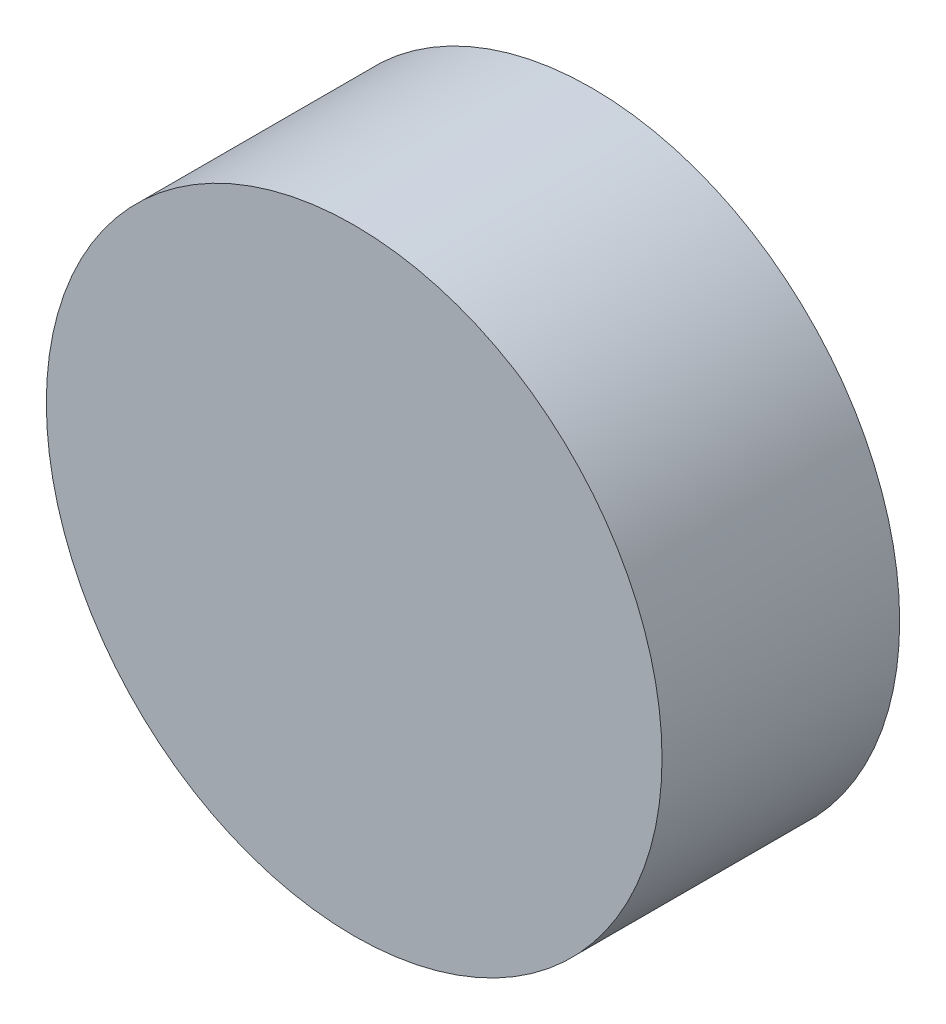
ISO-10303-21;
HEADER;
FILE_DESCRIPTION(('STEP AP214'),'2;1');
FILE_NAME('part.step','',(''),(''),'','','');
FILE_SCHEMA(('AUTOMOTIVE_DESIGN { 1 0 10303 214 1 1 1 1 }'));
ENDSEC;
DATA;
#1=APPLICATION_CONTEXT('core data for automotive mechanical design processes');
#2=APPLICATION_PROTOCOL_DEFINITION('international standard','automotive_design',2000,#1);
#3=PRODUCT_CONTEXT('',#1,'mechanical');
#4=PRODUCT('Part','Part','',(#3));
#5=PRODUCT_RELATED_PRODUCT_CATEGORY('part','',(#4));
#6=PRODUCT_DEFINITION_FORMATION('','',#4);
#7=PRODUCT_DEFINITION_CONTEXT('part definition',#1,'design');
#8=PRODUCT_DEFINITION('design','',#6,#7);
#9=PRODUCT_DEFINITION_SHAPE('','',#8);
#10=(LENGTH_UNIT() NAMED_UNIT(*) SI_UNIT(.MILLI.,.METRE.));
#11=(NAMED_UNIT(*) PLANE_ANGLE_UNIT() SI_UNIT($,.RADIAN.));
#12=(NAMED_UNIT(*) SI_UNIT($,.STERADIAN.) SOLID_ANGLE_UNIT());
#13=UNCERTAINTY_MEASURE_WITH_UNIT(LENGTH_MEASURE(1.E-05),#10,'distance_accuracy_value','');
#14=(GEOMETRIC_REPRESENTATION_CONTEXT(3) GLOBAL_UNCERTAINTY_ASSIGNED_CONTEXT((#13)) GLOBAL_UNIT_ASSIGNED_CONTEXT((#10,
#11,#12)) REPRESENTATION_CONTEXT('',''));
#15=CARTESIAN_POINT('',(0.,0.,0.));
#16=DIRECTION('',(0.,0.,1.));
#17=DIRECTION('',(1.,0.,0.));
#18=AXIS2_PLACEMENT_3D('',#15,#16,#17);
#19=CARTESIAN_POINT('',(-28.51,-1.0770329614269,-97.));
#20=DIRECTION('',(0.,0.,-1.));
#21=DIRECTION('',(0.,1.,0.));
#22=AXIS2_PLACEMENT_3D('',#19,#20,#21);
#23=PLANE('',#22);
#24=CARTESIAN_POINT('',(-16.6207701385947,12.,-97.));
#25=DIRECTION('',(0.,0.,-1.));
#26=DIRECTION('',(-1.,0.,0.));
#27=AXIS2_PLACEMENT_3D('',#24,#25,#26);
#28=CIRCLE('',#27,3.5);
#29=CARTESIAN_POINT('',(-19.4584626012816,14.0487804878049,-97.));
#30=VERTEX_POINT('',#29);
#31=CARTESIAN_POINT('',(-13.7830776759078,9.95121951219513,-97.));
#32=VERTEX_POINT('',#31);
#33=EDGE_CURVE('E121',#30,#32,#28,.T.);
#34=ORIENTED_EDGE('',*,*,#33,.F.);
#35=CARTESIAN_POINT('',(0.,0.,-97.));
#36=DIRECTION('',(0.,0.,-1.));
#37=DIRECTION('',(-1.,0.,0.));
#38=AXIS2_PLACEMENT_3D('',#35,#36,#37);
#39=CIRCLE('',#38,24.);
#40=CARTESIAN_POINT('',(-23.9952229713803,-0.478826224994294,-97.));
#41=VERTEX_POINT('',#40);
#42=EDGE_CURVE('E126',#41,#30,#39,.T.);
#43=ORIENTED_EDGE('',*,*,#42,.F.);
#44=CARTESIAN_POINT('',(-20.4959196213874,-0.408997400515948,-97.));
#45=DIRECTION('',(0.,0.,-1.));
#46=DIRECTION('',(-1.,0.,0.));
#47=AXIS2_PLACEMENT_3D('',#44,#45,#46);
#48=CIRCLE('',#47,3.5);
#49=CARTESIAN_POINT('',(-16.9966162713944,-0.339168576037625,-97.));
#50=VERTEX_POINT('',#49);
#51=EDGE_CURVE('E108',#50,#41,#48,.T.);
#52=ORIENTED_EDGE('',*,*,#51,.F.);
#53=CARTESIAN_POINT('',(0.,0.,-97.));
#54=DIRECTION('',(0.,0.,1.));
#55=DIRECTION('',(-1.,0.,0.));
#56=AXIS2_PLACEMENT_3D('',#53,#54,#55);
#57=CIRCLE('',#56,17.);
#58=EDGE_CURVE('E120',#32,#50,#57,.T.);
#59=ORIENTED_EDGE('',*,*,#58,.F.);
#60=EDGE_LOOP('',(#34,#43,#52,#59));
#61=FACE_BOUND('',#60,.T.);
#62=CARTESIAN_POINT('',(16.6207701385947,12.,-97.));
#63=DIRECTION('',(0.,0.,-1.));
#64=DIRECTION('',(1.,0.,0.));
#65=AXIS2_PLACEMENT_3D('',#62,#63,#64);
#66=CIRCLE('',#65,3.5);
#67=CARTESIAN_POINT('',(13.7830776759078,9.95121951219513,-97.));
#68=VERTEX_POINT('',#67);
#69=CARTESIAN_POINT('',(19.4584626012816,14.0487804878049,-97.));
#70=VERTEX_POINT('',#69);
#71=EDGE_CURVE('E166',#68,#70,#66,.T.);
#72=ORIENTED_EDGE('',*,*,#71,.F.);
#73=CARTESIAN_POINT('',(0.,0.,-97.));
#74=DIRECTION('',(0.,0.,1.));
#75=DIRECTION('',(1.,0.,0.));
#76=AXIS2_PLACEMENT_3D('',#73,#74,#75);
#77=CIRCLE('',#76,17.);
#78=CARTESIAN_POINT('',(16.9966162713944,-0.339168576037625,-97.));
#79=VERTEX_POINT('',#78);
#80=EDGE_CURVE('E164',#79,#68,#77,.T.);
#81=ORIENTED_EDGE('',*,*,#80,.F.);
#82=CARTESIAN_POINT('',(20.4959196213874,-0.408997400515948,-97.));
#83=DIRECTION('',(0.,0.,-1.));
#84=DIRECTION('',(1.,0.,0.));
#85=AXIS2_PLACEMENT_3D('',#82,#83,#84);
#86=CIRCLE('',#85,3.5);
#87=CARTESIAN_POINT('',(23.9952229713803,-0.478826224994294,-97.));
#88=VERTEX_POINT('',#87);
#89=EDGE_CURVE('E134',#88,#79,#86,.T.);
#90=ORIENTED_EDGE('',*,*,#89,.F.);
#91=CARTESIAN_POINT('',(0.,0.,-97.));
#92=DIRECTION('',(0.,0.,-1.));
#93=DIRECTION('',(1.,0.,0.));
#94=AXIS2_PLACEMENT_3D('',#91,#92,#93);
#95=CIRCLE('',#94,24.);
#96=EDGE_CURVE('E152',#70,#88,#95,.T.);
#97=ORIENTED_EDGE('',*,*,#96,.F.);
#98=EDGE_LOOP('',(#72,#81,#90,#97));
#99=FACE_BOUND('',#98,.T.);
#100=CARTESIAN_POINT('',(0.,0.,-97.));
#101=DIRECTION('',(0.,0.,1.));
#102=DIRECTION('',(1.,0.,0.));
#103=AXIS2_PLACEMENT_3D('',#100,#101,#102);
#104=CIRCLE('',#103,28.5);
#105=CARTESIAN_POINT('',(28.5,0.,-97.));
#106=VERTEX_POINT('',#105);
#107=EDGE_CURVE('E139',#106,#106,#104,.T.);
#108=ORIENTED_EDGE('',*,*,#107,.F.);
#109=EDGE_LOOP('',(#108));
#110=FACE_BOUND('',#109,.T.);
#111=ADVANCED_FACE('F41',(#61,#99,#110),#23,.T.);
#112=CARTESIAN_POINT('',(-28.51,27.5,-75.));
#113=DIRECTION('',(0.,0.,1.));
#114=DIRECTION('',(1.,0.,0.));
#115=AXIS2_PLACEMENT_3D('',#112,#113,#114);
#116=PLANE('',#115);
#117=CARTESIAN_POINT('',(0.,0.,-75.));
#118=DIRECTION('',(0.,0.,1.));
#119=DIRECTION('',(1.,0.,0.));
#120=AXIS2_PLACEMENT_3D('',#117,#118,#119);
#121=CIRCLE('',#120,28.5);
#122=CARTESIAN_POINT('',(28.5,0.,-75.));
#123=VERTEX_POINT('',#122);
#124=EDGE_CURVE('E141',#123,#123,#121,.T.);
#125=ORIENTED_EDGE('',*,*,#124,.T.);
#126=EDGE_LOOP('',(#125));
#127=FACE_BOUND('',#126,.T.);
#128=ADVANCED_FACE('F43',(#127),#116,.T.);
#129=CARTESIAN_POINT('',(20.4959196213874,-0.408997400515948,-92.));
#130=DIRECTION('',(0.,0.,-1.));
#131=DIRECTION('',(-1.,0.,0.));
#132=AXIS2_PLACEMENT_3D('',#129,#130,#131);
#133=CYLINDRICAL_SURFACE('',#132,3.5);
#134=ORIENTED_EDGE('',*,*,#89,.T.);
#135=DIRECTION('',(0.,0.,-1.));
#136=VECTOR('',#135,1.);
#137=CARTESIAN_POINT('',(16.9966162713944,-0.339168576037625,-92.));
#138=LINE('',#137,#136);
#139=CARTESIAN_POINT('',(16.9966162713944,-0.339168576037625,-92.));
#140=VERTEX_POINT('',#139);
#141=EDGE_CURVE('E161',#140,#79,#138,.T.);
#142=ORIENTED_EDGE('',*,*,#141,.F.);
#143=CARTESIAN_POINT('',(20.4959196213874,-0.408997400515948,-92.));
#144=DIRECTION('',(0.,0.,-1.));
#145=DIRECTION('',(1.,0.,0.));
#146=AXIS2_PLACEMENT_3D('',#143,#144,#145);
#147=CIRCLE('',#146,3.5);
#148=CARTESIAN_POINT('',(23.9952229713803,-0.478826224994294,-92.));
#149=VERTEX_POINT('',#148);
#150=EDGE_CURVE('E148',#149,#140,#147,.T.);
#151=ORIENTED_EDGE('',*,*,#150,.F.);
#152=DIRECTION('',(0.,0.,-1.));
#153=VECTOR('',#152,1.);
#154=CARTESIAN_POINT('',(23.9952229713803,-0.478826224994294,-92.));
#155=LINE('',#154,#153);
#156=EDGE_CURVE('E11',#149,#88,#155,.T.);
#157=ORIENTED_EDGE('',*,*,#156,.T.);
#158=EDGE_LOOP('',(#134,#142,#151,#157));
#159=FACE_BOUND('',#158,.T.);
#160=ADVANCED_FACE('F196',(#159),#133,.F.);
#161=CARTESIAN_POINT('',(10.2479598106937,-0.204498700257974,-92.));
#162=DIRECTION('',(0.,0.,1.));
#163=DIRECTION('',(1.,0.,0.));
#164=AXIS2_PLACEMENT_3D('',#161,#162,#163);
#165=PLANE('',#164);
#166=ORIENTED_EDGE('',*,*,#150,.T.);
#167=CARTESIAN_POINT('',(0.,0.,-92.));
#168=DIRECTION('',(0.,0.,1.));
#169=DIRECTION('',(1.,0.,0.));
#170=AXIS2_PLACEMENT_3D('',#167,#168,#169);
#171=CIRCLE('',#170,17.);
#172=CARTESIAN_POINT('',(13.7830776759078,9.95121951219513,-92.));
#173=VERTEX_POINT('',#172);
#174=EDGE_CURVE('E151',#140,#173,#171,.T.);
#175=ORIENTED_EDGE('',*,*,#174,.T.);
#176=CARTESIAN_POINT('',(16.6207701385947,12.,-92.));
#177=DIRECTION('',(0.,0.,-1.));
#178=DIRECTION('',(1.,0.,0.));
#179=AXIS2_PLACEMENT_3D('',#176,#177,#178);
#180=CIRCLE('',#179,3.5);
#181=CARTESIAN_POINT('',(19.4584626012816,14.0487804878049,-92.));
#182=VERTEX_POINT('',#181);
#183=EDGE_CURVE('E155',#173,#182,#180,.T.);
#184=ORIENTED_EDGE('',*,*,#183,.T.);
#185=CARTESIAN_POINT('',(0.,0.,-92.));
#186=DIRECTION('',(0.,0.,-1.));
#187=DIRECTION('',(1.,0.,0.));
#188=AXIS2_PLACEMENT_3D('',#185,#186,#187);
#189=CIRCLE('',#188,24.);
#190=EDGE_CURVE('E158',#182,#149,#189,.T.);
#191=ORIENTED_EDGE('',*,*,#190,.T.);
#192=EDGE_LOOP('',(#166,#175,#184,#191));
#193=FACE_BOUND('',#192,.T.);
#194=ADVANCED_FACE('F194',(#193),#165,.F.);
#195=CARTESIAN_POINT('',(16.6207701385947,12.,-92.));
#196=DIRECTION('',(0.,0.,-1.));
#197=DIRECTION('',(-1.,0.,0.));
#198=AXIS2_PLACEMENT_3D('',#195,#196,#197);
#199=CYLINDRICAL_SURFACE('',#198,3.5);
#200=ORIENTED_EDGE('',*,*,#71,.T.);
#201=DIRECTION('',(0.,0.,-1.));
#202=VECTOR('',#201,1.);
#203=CARTESIAN_POINT('',(19.4584626012816,14.0487804878049,-92.));
#204=LINE('',#203,#202);
#205=EDGE_CURVE('E51',#182,#70,#204,.T.);
#206=ORIENTED_EDGE('',*,*,#205,.F.);
#207=ORIENTED_EDGE('',*,*,#183,.F.);
#208=DIRECTION('',(0.,0.,-1.));
#209=VECTOR('',#208,1.);
#210=CARTESIAN_POINT('',(13.7830776759078,9.95121951219513,-92.));
#211=LINE('',#210,#209);
#212=EDGE_CURVE('E171',#173,#68,#211,.T.);
#213=ORIENTED_EDGE('',*,*,#212,.T.);
#214=EDGE_LOOP('',(#200,#206,#207,#213));
#215=FACE_BOUND('',#214,.T.);
#216=ADVANCED_FACE('F192',(#215),#199,.F.);
#217=CARTESIAN_POINT('',(-20.4959196213874,-0.408997400515948,-92.));
#218=DIRECTION('',(0.,0.,-1.));
#219=DIRECTION('',(-1.,0.,0.));
#220=AXIS2_PLACEMENT_3D('',#217,#218,#219);
#221=CYLINDRICAL_SURFACE('',#220,3.5);
#222=ORIENTED_EDGE('',*,*,#51,.T.);
#223=DIRECTION('',(0.,0.,-1.));
#224=VECTOR('',#223,1.);
#225=CARTESIAN_POINT('',(-23.9952229713803,-0.478826224994294,-92.));
#226=LINE('',#225,#224);
#227=CARTESIAN_POINT('',(-23.9952229713803,-0.478826224994294,-92.));
#228=VERTEX_POINT('',#227);
#229=EDGE_CURVE('E101',#228,#41,#226,.T.);
#230=ORIENTED_EDGE('',*,*,#229,.F.);
#231=CARTESIAN_POINT('',(-20.4959196213874,-0.408997400515948,-92.));
#232=DIRECTION('',(0.,0.,-1.));
#233=DIRECTION('',(-1.,0.,0.));
#234=AXIS2_PLACEMENT_3D('',#231,#232,#233);
#235=CIRCLE('',#234,3.5);
#236=CARTESIAN_POINT('',(-16.9966162713944,-0.339168576037625,-92.));
#237=VERTEX_POINT('',#236);
#238=EDGE_CURVE('E45',#237,#228,#235,.T.);
#239=ORIENTED_EDGE('',*,*,#238,.F.);
#240=DIRECTION('',(0.,0.,-1.));
#241=VECTOR('',#240,1.);
#242=CARTESIAN_POINT('',(-16.9966162713944,-0.339168576037625,-92.));
#243=LINE('',#242,#241);
#244=EDGE_CURVE('E129',#237,#50,#243,.T.);
#245=ORIENTED_EDGE('',*,*,#244,.T.);
#246=EDGE_LOOP('',(#222,#230,#239,#245));
#247=FACE_BOUND('',#246,.T.);
#248=ADVANCED_FACE('F102',(#247),#221,.F.);
#249=CARTESIAN_POINT('',(-10.2479598106937,-0.204498700257974,-92.));
#250=DIRECTION('',(0.,0.,-1.));
#251=DIRECTION('',(-1.,0.,0.));
#252=AXIS2_PLACEMENT_3D('',#249,#250,#251);
#253=PLANE('',#252);
#254=ORIENTED_EDGE('',*,*,#238,.T.);
#255=CARTESIAN_POINT('',(0.,0.,-92.));
#256=DIRECTION('',(0.,0.,-1.));
#257=DIRECTION('',(-1.,0.,0.));
#258=AXIS2_PLACEMENT_3D('',#255,#256,#257);
#259=CIRCLE('',#258,24.);
#260=CARTESIAN_POINT('',(-19.4584626012816,14.0487804878049,-92.));
#261=VERTEX_POINT('',#260);
#262=EDGE_CURVE('E113',#228,#261,#259,.T.);
#263=ORIENTED_EDGE('',*,*,#262,.T.);
#264=CARTESIAN_POINT('',(-16.6207701385947,12.,-92.));
#265=DIRECTION('',(0.,0.,-1.));
#266=DIRECTION('',(-1.,0.,0.));
#267=AXIS2_PLACEMENT_3D('',#264,#265,#266);
#268=CIRCLE('',#267,3.5);
#269=CARTESIAN_POINT('',(-13.7830776759078,9.95121951219513,-92.));
#270=VERTEX_POINT('',#269);
#271=EDGE_CURVE('E117',#261,#270,#268,.T.);
#272=ORIENTED_EDGE('',*,*,#271,.T.);
#273=CARTESIAN_POINT('',(0.,0.,-92.));
#274=DIRECTION('',(0.,0.,1.));
#275=DIRECTION('',(-1.,0.,0.));
#276=AXIS2_PLACEMENT_3D('',#273,#274,#275);
#277=CIRCLE('',#276,17.);
#278=EDGE_CURVE('E110',#270,#237,#277,.T.);
#279=ORIENTED_EDGE('',*,*,#278,.T.);
#280=EDGE_LOOP('',(#254,#263,#272,#279));
#281=FACE_BOUND('',#280,.T.);
#282=ADVANCED_FACE('F118',(#281),#253,.T.);
#283=CARTESIAN_POINT('',(-16.6207701385947,12.,-92.));
#284=DIRECTION('',(0.,0.,-1.));
#285=DIRECTION('',(-1.,0.,0.));
#286=AXIS2_PLACEMENT_3D('',#283,#284,#285);
#287=CYLINDRICAL_SURFACE('',#286,3.5);
#288=ORIENTED_EDGE('',*,*,#33,.T.);
#289=DIRECTION('',(0.,0.,-1.));
#290=VECTOR('',#289,1.);
#291=CARTESIAN_POINT('',(-13.7830776759078,9.95121951219513,-92.));
#292=LINE('',#291,#290);
#293=EDGE_CURVE('E138',#270,#32,#292,.T.);
#294=ORIENTED_EDGE('',*,*,#293,.F.);
#295=ORIENTED_EDGE('',*,*,#271,.F.);
#296=DIRECTION('',(0.,0.,-1.));
#297=VECTOR('',#296,1.);
#298=CARTESIAN_POINT('',(-19.4584626012816,14.0487804878049,-92.));
#299=LINE('',#298,#297);
#300=EDGE_CURVE('E94',#261,#30,#299,.T.);
#301=ORIENTED_EDGE('',*,*,#300,.T.);
#302=EDGE_LOOP('',(#288,#294,#295,#301));
#303=FACE_BOUND('',#302,.T.);
#304=ADVANCED_FACE('F177',(#303),#287,.F.);
#305=CARTESIAN_POINT('',(0.,0.,-92.));
#306=DIRECTION('',(0.,0.,-1.));
#307=DIRECTION('',(-1.,0.,0.));
#308=AXIS2_PLACEMENT_3D('',#305,#306,#307);
#309=CYLINDRICAL_SURFACE('',#308,24.);
#310=ORIENTED_EDGE('',*,*,#42,.T.);
#311=ORIENTED_EDGE('',*,*,#300,.F.);
#312=ORIENTED_EDGE('',*,*,#262,.F.);
#313=ORIENTED_EDGE('',*,*,#229,.T.);
#314=EDGE_LOOP('',(#310,#311,#312,#313));
#315=FACE_BOUND('',#314,.T.);
#316=ADVANCED_FACE('F114',(#315),#309,.F.);
#317=CARTESIAN_POINT('',(0.,0.,-92.));
#318=DIRECTION('',(0.,0.,-1.));
#319=DIRECTION('',(-1.,0.,0.));
#320=AXIS2_PLACEMENT_3D('',#317,#318,#319);
#321=CYLINDRICAL_SURFACE('',#320,17.);
#322=ORIENTED_EDGE('',*,*,#58,.T.);
#323=ORIENTED_EDGE('',*,*,#244,.F.);
#324=ORIENTED_EDGE('',*,*,#278,.F.);
#325=ORIENTED_EDGE('',*,*,#293,.T.);
#326=EDGE_LOOP('',(#322,#323,#324,#325));
#327=FACE_BOUND('',#326,.T.);
#328=ADVANCED_FACE('F137',(#327),#321,.T.);
#329=CARTESIAN_POINT('',(0.,0.,-92.));
#330=DIRECTION('',(0.,0.,-1.));
#331=DIRECTION('',(-1.,0.,0.));
#332=AXIS2_PLACEMENT_3D('',#329,#330,#331);
#333=CYLINDRICAL_SURFACE('',#332,17.);
#334=ORIENTED_EDGE('',*,*,#80,.T.);
#335=ORIENTED_EDGE('',*,*,#212,.F.);
#336=ORIENTED_EDGE('',*,*,#174,.F.);
#337=ORIENTED_EDGE('',*,*,#141,.T.);
#338=EDGE_LOOP('',(#334,#335,#336,#337));
#339=FACE_BOUND('',#338,.T.);
#340=ADVANCED_FACE('F188',(#339),#333,.T.);
#341=CARTESIAN_POINT('',(0.,0.,-92.));
#342=DIRECTION('',(0.,0.,-1.));
#343=DIRECTION('',(-1.,0.,0.));
#344=AXIS2_PLACEMENT_3D('',#341,#342,#343);
#345=CYLINDRICAL_SURFACE('',#344,24.);
#346=ORIENTED_EDGE('',*,*,#96,.T.);
#347=ORIENTED_EDGE('',*,*,#156,.F.);
#348=ORIENTED_EDGE('',*,*,#190,.F.);
#349=ORIENTED_EDGE('',*,*,#205,.T.);
#350=EDGE_LOOP('',(#346,#347,#348,#349));
#351=FACE_BOUND('',#350,.T.);
#352=ADVANCED_FACE('F200',(#351),#345,.F.);
#353=CARTESIAN_POINT('',(0.,0.,94.0086439358806));
#354=DIRECTION('',(0.,0.,1.));
#355=DIRECTION('',(1.,0.,0.));
#356=AXIS2_PLACEMENT_3D('',#353,#354,#355);
#357=CYLINDRICAL_SURFACE('',#356,28.5);
#358=ORIENTED_EDGE('',*,*,#124,.F.);
#359=EDGE_LOOP('',(#358));
#360=FACE_BOUND('',#359,.T.);
#361=ORIENTED_EDGE('',*,*,#107,.T.);
#362=EDGE_LOOP('',(#361));
#363=FACE_BOUND('',#362,.T.);
#364=ADVANCED_FACE('F202',(#360,#363),#357,.T.);
#365=CLOSED_SHELL('',(#111,#128,#160,#194,#216,#248,#282,#304,#316,#328,#340,#352,#364));
#366=MANIFOLD_SOLID_BREP('B2',#365);
#367=ADVANCED_BREP_SHAPE_REPRESENTATION('',(#18,#366),#14);
#368=SHAPE_DEFINITION_REPRESENTATION(#9,#367);
ENDSEC;
END-ISO-10303-21;
